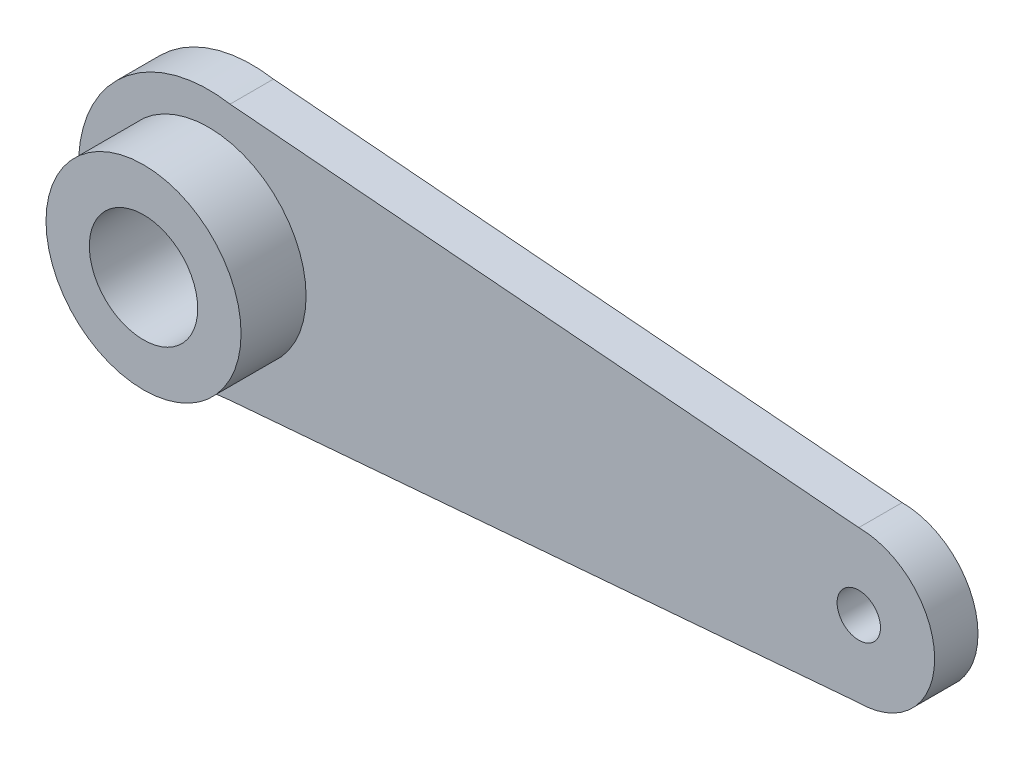
ISO-10303-21;
HEADER;
FILE_DESCRIPTION(('STEP AP214'),'2;1');
FILE_NAME('part.step','',(''),(''),'','','');
FILE_SCHEMA(('AUTOMOTIVE_DESIGN { 1 0 10303 214 1 1 1 1 }'));
ENDSEC;
DATA;
#1=APPLICATION_CONTEXT('core data for automotive mechanical design processes');
#2=APPLICATION_PROTOCOL_DEFINITION('international standard','automotive_design',2000,#1);
#3=PRODUCT_CONTEXT('',#1,'mechanical');
#4=PRODUCT('Part','Part','',(#3));
#5=PRODUCT_RELATED_PRODUCT_CATEGORY('part','',(#4));
#6=PRODUCT_DEFINITION_FORMATION('','',#4);
#7=PRODUCT_DEFINITION_CONTEXT('part definition',#1,'design');
#8=PRODUCT_DEFINITION('design','',#6,#7);
#9=PRODUCT_DEFINITION_SHAPE('','',#8);
#10=(LENGTH_UNIT() NAMED_UNIT(*) SI_UNIT(.MILLI.,.METRE.));
#11=(NAMED_UNIT(*) PLANE_ANGLE_UNIT() SI_UNIT($,.RADIAN.));
#12=(NAMED_UNIT(*) SI_UNIT($,.STERADIAN.) SOLID_ANGLE_UNIT());
#13=UNCERTAINTY_MEASURE_WITH_UNIT(LENGTH_MEASURE(1.E-05),#10,'distance_accuracy_value','');
#14=(GEOMETRIC_REPRESENTATION_CONTEXT(3) GLOBAL_UNCERTAINTY_ASSIGNED_CONTEXT((#13)) GLOBAL_UNIT_ASSIGNED_CONTEXT((#10,
#11,#12)) REPRESENTATION_CONTEXT('',''));
#15=CARTESIAN_POINT('',(0.,0.,0.));
#16=DIRECTION('',(0.,0.,1.));
#17=DIRECTION('',(1.,0.,0.));
#18=AXIS2_PLACEMENT_3D('',#15,#16,#17);
#19=CARTESIAN_POINT('',(30.,0.,2.));
#20=DIRECTION('',(0.,0.,-1.));
#21=DIRECTION('',(-1.,0.,0.));
#22=AXIS2_PLACEMENT_3D('',#19,#20,#21);
#23=CYLINDRICAL_SURFACE('',#22,3.5);
#24=CARTESIAN_POINT('',(30.,0.,0.));
#25=DIRECTION('',(0.,0.,1.));
#26=DIRECTION('',(1.,0.,0.));
#27=AXIS2_PLACEMENT_3D('',#24,#25,#26);
#28=CIRCLE('',#27,3.5);
#29=CARTESIAN_POINT('',(30.,-3.5,0.));
#30=VERTEX_POINT('',#29);
#31=CARTESIAN_POINT('',(30.,3.5,0.));
#32=VERTEX_POINT('',#31);
#33=EDGE_CURVE('E118',#30,#32,#28,.T.);
#34=ORIENTED_EDGE('',*,*,#33,.T.);
#35=DIRECTION('',(0.,0.,-1.));
#36=VECTOR('',#35,1.);
#37=CARTESIAN_POINT('',(30.,3.5,2.));
#38=LINE('',#37,#36);
#39=CARTESIAN_POINT('',(30.,3.5,2.));
#40=VERTEX_POINT('',#39);
#41=EDGE_CURVE('E72',#40,#32,#38,.T.);
#42=ORIENTED_EDGE('',*,*,#41,.F.);
#43=CARTESIAN_POINT('',(30.,0.,2.));
#44=DIRECTION('',(0.,0.,1.));
#45=DIRECTION('',(1.,0.,0.));
#46=AXIS2_PLACEMENT_3D('',#43,#44,#45);
#47=CIRCLE('',#46,3.5);
#48=CARTESIAN_POINT('',(30.,-3.5,2.));
#49=VERTEX_POINT('',#48);
#50=EDGE_CURVE('E107',#49,#40,#47,.T.);
#51=ORIENTED_EDGE('',*,*,#50,.F.);
#52=DIRECTION('',(0.,0.,-1.));
#53=VECTOR('',#52,1.);
#54=CARTESIAN_POINT('',(30.,-3.5,2.));
#55=LINE('',#54,#53);
#56=EDGE_CURVE('E12',#49,#30,#55,.T.);
#57=ORIENTED_EDGE('',*,*,#56,.T.);
#58=EDGE_LOOP('',(#34,#42,#51,#57));
#59=FACE_BOUND('',#58,.T.);
#60=ADVANCED_FACE('F61',(#59),#23,.T.);
#61=CARTESIAN_POINT('',(0.496551724137931,5.95862068965517,2.));
#62=DIRECTION('',(-0.08304547985374,-0.99654575824488,0.));
#63=DIRECTION('',(0.99654575824488,-0.08304547985374,0.));
#64=AXIS2_PLACEMENT_3D('',#61,#62,#63);
#65=PLANE('',#64);
#66=DIRECTION('',(-0.99654575824488,0.08304547985374,0.));
#67=VECTOR('',#66,1.);
#68=CARTESIAN_POINT('',(0.496551724137931,5.95862068965517,0.));
#69=LINE('',#68,#67);
#70=CARTESIAN_POINT('',(0.993103448275866,5.91724137931035,0.));
#71=VERTEX_POINT('',#70);
#72=EDGE_CURVE('E138',#32,#71,#69,.T.);
#73=ORIENTED_EDGE('',*,*,#72,.T.);
#74=DIRECTION('',(0.,0.,-1.));
#75=VECTOR('',#74,1.);
#76=CARTESIAN_POINT('',(0.993103448275866,5.91724137931035,2.));
#77=LINE('',#76,#75);
#78=CARTESIAN_POINT('',(0.993103448275866,5.91724137931035,2.));
#79=VERTEX_POINT('',#78);
#80=EDGE_CURVE('E94',#79,#71,#77,.T.);
#81=ORIENTED_EDGE('',*,*,#80,.F.);
#82=DIRECTION('',(-0.99654575824488,0.08304547985374,0.));
#83=VECTOR('',#82,1.);
#84=CARTESIAN_POINT('',(0.496551724137931,5.95862068965517,2.));
#85=LINE('',#84,#83);
#86=EDGE_CURVE('E111',#40,#79,#85,.T.);
#87=ORIENTED_EDGE('',*,*,#86,.F.);
#88=ORIENTED_EDGE('',*,*,#41,.T.);
#89=EDGE_LOOP('',(#73,#81,#87,#88));
#90=FACE_BOUND('',#89,.T.);
#91=ADVANCED_FACE('F124',(#90),#65,.F.);
#92=CARTESIAN_POINT('',(0.496551724137931,-5.95862068965517,2.));
#93=DIRECTION('',(0.08304547985374,-0.99654575824488,0.));
#94=DIRECTION('',(0.99654575824488,0.08304547985374,0.));
#95=AXIS2_PLACEMENT_3D('',#92,#93,#94);
#96=PLANE('',#95);
#97=DIRECTION('',(-0.99654575824488,-0.08304547985374,0.));
#98=VECTOR('',#97,1.);
#99=CARTESIAN_POINT('',(0.496551724137931,-5.95862068965517,0.));
#100=LINE('',#99,#98);
#101=CARTESIAN_POINT('',(0.993103448275866,-5.91724137931035,0.));
#102=VERTEX_POINT('',#101);
#103=EDGE_CURVE('E131',#30,#102,#100,.T.);
#104=ORIENTED_EDGE('',*,*,#103,.F.);
#105=ORIENTED_EDGE('',*,*,#56,.F.);
#106=DIRECTION('',(-0.99654575824488,-0.08304547985374,0.));
#107=VECTOR('',#106,1.);
#108=CARTESIAN_POINT('',(0.496551724137931,-5.95862068965517,2.));
#109=LINE('',#108,#107);
#110=CARTESIAN_POINT('',(0.993103448275866,-5.91724137931035,2.));
#111=VERTEX_POINT('',#110);
#112=EDGE_CURVE('E112',#49,#111,#109,.T.);
#113=ORIENTED_EDGE('',*,*,#112,.T.);
#114=DIRECTION('',(0.,0.,-1.));
#115=VECTOR('',#114,1.);
#116=CARTESIAN_POINT('',(0.993103448275866,-5.91724137931035,2.));
#117=LINE('',#116,#115);
#118=EDGE_CURVE('E81',#111,#102,#117,.T.);
#119=ORIENTED_EDGE('',*,*,#118,.T.);
#120=EDGE_LOOP('',(#104,#105,#113,#119));
#121=FACE_BOUND('',#120,.T.);
#122=ADVANCED_FACE('F161',(#121),#96,.T.);
#123=CARTESIAN_POINT('',(0.,0.,0.));
#124=DIRECTION('',(0.,0.,1.));
#125=DIRECTION('',(1.,0.,0.));
#126=AXIS2_PLACEMENT_3D('',#123,#124,#125);
#127=PLANE('',#126);
#128=CARTESIAN_POINT('',(30.,0.,0.));
#129=DIRECTION('',(0.,0.,-1.));
#130=DIRECTION('',(-1.,0.,0.));
#131=AXIS2_PLACEMENT_3D('',#128,#129,#130);
#132=CIRCLE('',#131,1.);
#133=CARTESIAN_POINT('',(29.,0.,0.));
#134=VERTEX_POINT('',#133);
#135=EDGE_CURVE('E202',#134,#134,#132,.T.);
#136=ORIENTED_EDGE('',*,*,#135,.F.);
#137=EDGE_LOOP('',(#136));
#138=FACE_BOUND('',#137,.T.);
#139=CARTESIAN_POINT('',(0.,0.,0.));
#140=DIRECTION('',(0.,0.,1.));
#141=DIRECTION('',(1.,0.,0.));
#142=AXIS2_PLACEMENT_3D('',#139,#140,#141);
#143=CIRCLE('',#142,2.5);
#144=CARTESIAN_POINT('',(2.5,0.,0.));
#145=VERTEX_POINT('',#144);
#146=EDGE_CURVE('E155',#145,#145,#143,.T.);
#147=ORIENTED_EDGE('',*,*,#146,.T.);
#148=EDGE_LOOP('',(#147));
#149=FACE_BOUND('',#148,.T.);
#150=ORIENTED_EDGE('',*,*,#103,.T.);
#151=CARTESIAN_POINT('',(0.,0.,0.));
#152=DIRECTION('',(0.,0.,1.));
#153=DIRECTION('',(1.,0.,0.));
#154=AXIS2_PLACEMENT_3D('',#151,#152,#153);
#155=CIRCLE('',#154,6.);
#156=EDGE_CURVE('E144',#71,#102,#155,.T.);
#157=ORIENTED_EDGE('',*,*,#156,.F.);
#158=ORIENTED_EDGE('',*,*,#72,.F.);
#159=ORIENTED_EDGE('',*,*,#33,.F.);
#160=EDGE_LOOP('',(#150,#157,#158,#159));
#161=FACE_BOUND('',#160,.T.);
#162=ADVANCED_FACE('F163',(#138,#149,#161),#127,.F.);
#163=CARTESIAN_POINT('',(0.,0.,2.));
#164=DIRECTION('',(0.,0.,1.));
#165=DIRECTION('',(1.,0.,0.));
#166=AXIS2_PLACEMENT_3D('',#163,#164,#165);
#167=PLANE('',#166);
#168=CARTESIAN_POINT('',(30.,0.,2.));
#169=DIRECTION('',(0.,0.,1.));
#170=DIRECTION('',(1.,0.,0.));
#171=AXIS2_PLACEMENT_3D('',#168,#169,#170);
#172=CIRCLE('',#171,1.);
#173=CARTESIAN_POINT('',(31.,0.,2.));
#174=VERTEX_POINT('',#173);
#175=EDGE_CURVE('E65',#174,#174,#172,.T.);
#176=ORIENTED_EDGE('',*,*,#175,.F.);
#177=EDGE_LOOP('',(#176));
#178=FACE_BOUND('',#177,.T.);
#179=CARTESIAN_POINT('',(0.,0.,2.));
#180=DIRECTION('',(0.,0.,1.));
#181=DIRECTION('',(1.,0.,0.));
#182=AXIS2_PLACEMENT_3D('',#179,#180,#181);
#183=CIRCLE('',#182,4.5);
#184=CARTESIAN_POINT('',(4.5,0.,2.));
#185=VERTEX_POINT('',#184);
#186=EDGE_CURVE('E149',#185,#185,#183,.T.);
#187=ORIENTED_EDGE('',*,*,#186,.F.);
#188=EDGE_LOOP('',(#187));
#189=FACE_BOUND('',#188,.T.);
#190=ORIENTED_EDGE('',*,*,#112,.F.);
#191=ORIENTED_EDGE('',*,*,#50,.T.);
#192=ORIENTED_EDGE('',*,*,#86,.T.);
#193=CARTESIAN_POINT('',(0.,0.,2.));
#194=DIRECTION('',(0.,0.,1.));
#195=DIRECTION('',(1.,0.,0.));
#196=AXIS2_PLACEMENT_3D('',#193,#194,#195);
#197=CIRCLE('',#196,6.);
#198=EDGE_CURVE('E135',#79,#111,#197,.T.);
#199=ORIENTED_EDGE('',*,*,#198,.T.);
#200=EDGE_LOOP('',(#190,#191,#192,#199));
#201=FACE_BOUND('',#200,.T.);
#202=ADVANCED_FACE('F109',(#178,#189,#201),#167,.T.);
#203=CARTESIAN_POINT('',(0.,0.,2.));
#204=DIRECTION('',(0.,0.,-1.));
#205=DIRECTION('',(-1.,0.,0.));
#206=AXIS2_PLACEMENT_3D('',#203,#204,#205);
#207=CYLINDRICAL_SURFACE('',#206,6.);
#208=ORIENTED_EDGE('',*,*,#118,.F.);
#209=ORIENTED_EDGE('',*,*,#198,.F.);
#210=ORIENTED_EDGE('',*,*,#80,.T.);
#211=ORIENTED_EDGE('',*,*,#156,.T.);
#212=EDGE_LOOP('',(#208,#209,#210,#211));
#213=FACE_BOUND('',#212,.T.);
#214=ADVANCED_FACE('F63',(#213),#207,.T.);
#215=CARTESIAN_POINT('',(0.,0.,5.));
#216=DIRECTION('',(0.,0.,-1.));
#217=DIRECTION('',(-1.,0.,0.));
#218=AXIS2_PLACEMENT_3D('',#215,#216,#217);
#219=CYLINDRICAL_SURFACE('',#218,4.5);
#220=CARTESIAN_POINT('',(0.,0.,5.));
#221=DIRECTION('',(0.,0.,1.));
#222=DIRECTION('',(1.,0.,0.));
#223=AXIS2_PLACEMENT_3D('',#220,#221,#222);
#224=CIRCLE('',#223,4.5);
#225=CARTESIAN_POINT('',(4.5,0.,5.));
#226=VERTEX_POINT('',#225);
#227=EDGE_CURVE('E146',#226,#226,#224,.T.);
#228=ORIENTED_EDGE('',*,*,#227,.F.);
#229=EDGE_LOOP('',(#228));
#230=FACE_BOUND('',#229,.T.);
#231=ORIENTED_EDGE('',*,*,#186,.T.);
#232=EDGE_LOOP('',(#231));
#233=FACE_BOUND('',#232,.T.);
#234=ADVANCED_FACE('F180',(#230,#233),#219,.T.);
#235=CARTESIAN_POINT('',(0.,0.,5.));
#236=DIRECTION('',(0.,0.,1.));
#237=DIRECTION('',(1.,0.,0.));
#238=AXIS2_PLACEMENT_3D('',#235,#236,#237);
#239=PLANE('',#238);
#240=CARTESIAN_POINT('',(0.,0.,5.));
#241=DIRECTION('',(0.,0.,1.));
#242=DIRECTION('',(1.,0.,0.));
#243=AXIS2_PLACEMENT_3D('',#240,#241,#242);
#244=CIRCLE('',#243,2.5);
#245=CARTESIAN_POINT('',(2.5,0.,5.));
#246=VERTEX_POINT('',#245);
#247=EDGE_CURVE('E158',#246,#246,#244,.T.);
#248=ORIENTED_EDGE('',*,*,#247,.F.);
#249=EDGE_LOOP('',(#248));
#250=FACE_BOUND('',#249,.T.);
#251=ORIENTED_EDGE('',*,*,#227,.T.);
#252=EDGE_LOOP('',(#251));
#253=FACE_BOUND('',#252,.T.);
#254=ADVANCED_FACE('F183',(#250,#253),#239,.T.);
#255=CARTESIAN_POINT('',(0.,0.,0.));
#256=DIRECTION('',(0.,0.,1.));
#257=DIRECTION('',(1.,0.,0.));
#258=AXIS2_PLACEMENT_3D('',#255,#256,#257);
#259=CYLINDRICAL_SURFACE('',#258,2.5);
#260=ORIENTED_EDGE('',*,*,#146,.F.);
#261=EDGE_LOOP('',(#260));
#262=FACE_BOUND('',#261,.T.);
#263=ORIENTED_EDGE('',*,*,#247,.T.);
#264=EDGE_LOOP('',(#263));
#265=FACE_BOUND('',#264,.T.);
#266=ADVANCED_FACE('F187',(#262,#265),#259,.F.);
#267=CARTESIAN_POINT('',(30.,0.,5.));
#268=DIRECTION('',(0.,0.,-1.));
#269=DIRECTION('',(-1.,0.,0.));
#270=AXIS2_PLACEMENT_3D('',#267,#268,#269);
#271=CYLINDRICAL_SURFACE('',#270,1.);
#272=ORIENTED_EDGE('',*,*,#175,.T.);
#273=EDGE_LOOP('',(#272));
#274=FACE_BOUND('',#273,.T.);
#275=ORIENTED_EDGE('',*,*,#135,.T.);
#276=EDGE_LOOP('',(#275));
#277=FACE_BOUND('',#276,.T.);
#278=ADVANCED_FACE('F191',(#274,#277),#271,.F.);
#279=CLOSED_SHELL('',(#60,#91,#122,#162,#202,#214,#234,#254,#266,#278));
#280=MANIFOLD_SOLID_BREP('B2',#279);
#281=ADVANCED_BREP_SHAPE_REPRESENTATION('',(#18,#280),#14);
#282=SHAPE_DEFINITION_REPRESENTATION(#9,#281);
ENDSEC;
END-ISO-10303-21;
